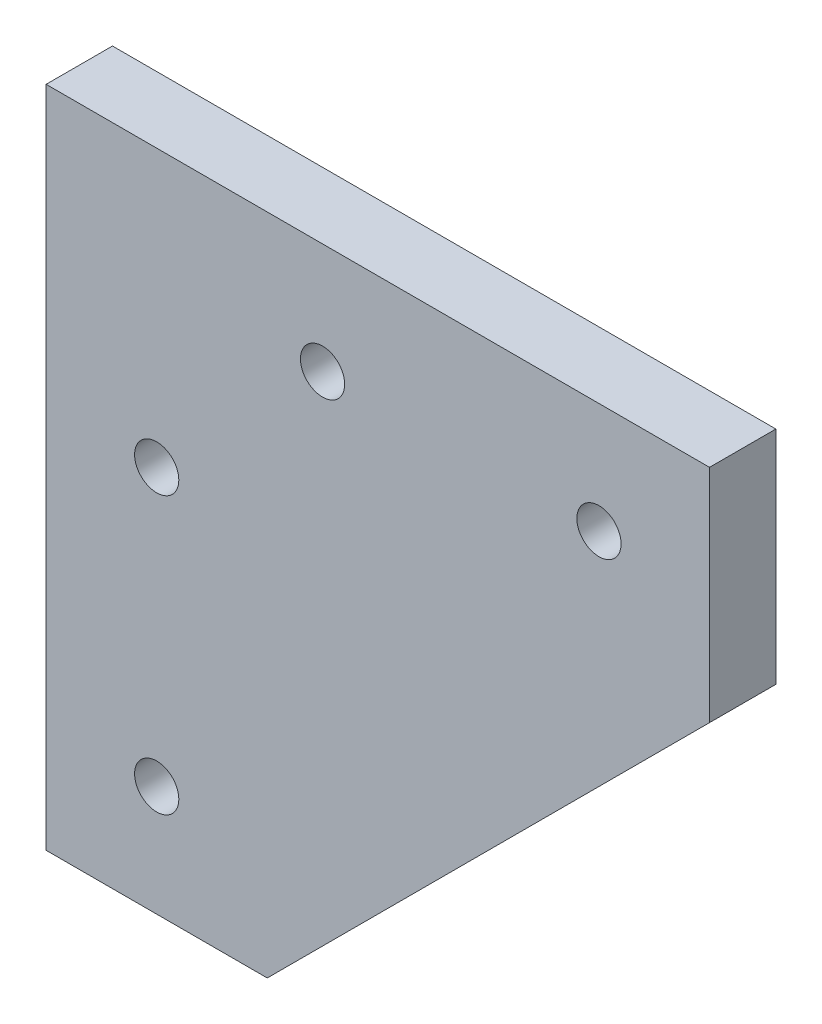
ISO-10303-21;
HEADER;
FILE_DESCRIPTION(('STEP AP214'),'2;1');
FILE_NAME('part.step','',(''),(''),'','','');
FILE_SCHEMA(('AUTOMOTIVE_DESIGN { 1 0 10303 214 1 1 1 1 }'));
ENDSEC;
DATA;
#1=APPLICATION_CONTEXT('core data for automotive mechanical design processes');
#2=APPLICATION_PROTOCOL_DEFINITION('international standard','automotive_design',2000,#1);
#3=PRODUCT_CONTEXT('',#1,'mechanical');
#4=PRODUCT('Part','Part','',(#3));
#5=PRODUCT_RELATED_PRODUCT_CATEGORY('part','',(#4));
#6=PRODUCT_DEFINITION_FORMATION('','',#4);
#7=PRODUCT_DEFINITION_CONTEXT('part definition',#1,'design');
#8=PRODUCT_DEFINITION('design','',#6,#7);
#9=PRODUCT_DEFINITION_SHAPE('','',#8);
#10=(LENGTH_UNIT() NAMED_UNIT(*) SI_UNIT(.MILLI.,.METRE.));
#11=(NAMED_UNIT(*) PLANE_ANGLE_UNIT() SI_UNIT($,.RADIAN.));
#12=(NAMED_UNIT(*) SI_UNIT($,.STERADIAN.) SOLID_ANGLE_UNIT());
#13=UNCERTAINTY_MEASURE_WITH_UNIT(LENGTH_MEASURE(1.E-05),#10,'distance_accuracy_value','');
#14=(GEOMETRIC_REPRESENTATION_CONTEXT(3) GLOBAL_UNCERTAINTY_ASSIGNED_CONTEXT((#13)) GLOBAL_UNIT_ASSIGNED_CONTEXT((#10,
#11,#12)) REPRESENTATION_CONTEXT('',''));
#15=CARTESIAN_POINT('',(0.,0.,0.));
#16=DIRECTION('',(0.,0.,1.));
#17=DIRECTION('',(1.,0.,0.));
#18=AXIS2_PLACEMENT_3D('',#15,#16,#17);
#19=CARTESIAN_POINT('',(0.,0.,6.));
#20=DIRECTION('',(0.,0.,1.));
#21=DIRECTION('',(1.,0.,0.));
#22=AXIS2_PLACEMENT_3D('',#19,#20,#21);
#23=PLANE('',#22);
#24=CARTESIAN_POINT('',(10.,-50.,6.));
#25=DIRECTION('',(0.,0.,1.));
#26=DIRECTION('',(1.,0.,0.));
#27=AXIS2_PLACEMENT_3D('',#24,#25,#26);
#28=CIRCLE('',#27,2.);
#29=CARTESIAN_POINT('',(12.,-50.,6.));
#30=VERTEX_POINT('',#29);
#31=EDGE_CURVE('E171',#30,#30,#28,.T.);
#32=ORIENTED_EDGE('',*,*,#31,.F.);
#33=EDGE_LOOP('',(#32));
#34=FACE_BOUND('',#33,.T.);
#35=CARTESIAN_POINT('',(50.,-10.,6.));
#36=DIRECTION('',(0.,0.,1.));
#37=DIRECTION('',(1.,0.,0.));
#38=AXIS2_PLACEMENT_3D('',#35,#36,#37);
#39=CIRCLE('',#38,2.);
#40=CARTESIAN_POINT('',(52.,-10.,6.));
#41=VERTEX_POINT('',#40);
#42=EDGE_CURVE('E111',#41,#41,#39,.T.);
#43=ORIENTED_EDGE('',*,*,#42,.F.);
#44=EDGE_LOOP('',(#43));
#45=FACE_BOUND('',#44,.T.);
#46=DIRECTION('',(0.,-1.,0.));
#47=VECTOR('',#46,1.);
#48=CARTESIAN_POINT('',(0.,0.,6.));
#49=LINE('',#48,#47);
#50=CARTESIAN_POINT('',(0.,0.,6.));
#51=VERTEX_POINT('',#50);
#52=CARTESIAN_POINT('',(0.,-60.,6.));
#53=VERTEX_POINT('',#52);
#54=EDGE_CURVE('E116',#51,#53,#49,.T.);
#55=ORIENTED_EDGE('',*,*,#54,.T.);
#56=DIRECTION('',(1.,0.,0.));
#57=VECTOR('',#56,1.);
#58=CARTESIAN_POINT('',(0.,-60.,6.));
#59=LINE('',#58,#57);
#60=CARTESIAN_POINT('',(20.,-60.,6.));
#61=VERTEX_POINT('',#60);
#62=EDGE_CURVE('E83',#53,#61,#59,.T.);
#63=ORIENTED_EDGE('',*,*,#62,.T.);
#64=DIRECTION('',(0.707106781186548,0.707106781186548,0.));
#65=VECTOR('',#64,1.);
#66=CARTESIAN_POINT('',(20.,-60.,6.));
#67=LINE('',#66,#65);
#68=CARTESIAN_POINT('',(60.,-20.,6.));
#69=VERTEX_POINT('',#68);
#70=EDGE_CURVE('E87',#61,#69,#67,.T.);
#71=ORIENTED_EDGE('',*,*,#70,.T.);
#72=DIRECTION('',(0.,1.,0.));
#73=VECTOR('',#72,1.);
#74=CARTESIAN_POINT('',(60.,0.,6.));
#75=LINE('',#74,#73);
#76=CARTESIAN_POINT('',(60.,0.,6.));
#77=VERTEX_POINT('',#76);
#78=EDGE_CURVE('E91',#69,#77,#75,.T.);
#79=ORIENTED_EDGE('',*,*,#78,.T.);
#80=DIRECTION('',(-1.,0.,0.));
#81=VECTOR('',#80,1.);
#82=CARTESIAN_POINT('',(0.,0.,6.));
#83=LINE('',#82,#81);
#84=EDGE_CURVE('E49',#77,#51,#83,.T.);
#85=ORIENTED_EDGE('',*,*,#84,.T.);
#86=EDGE_LOOP('',(#55,#63,#71,#79,#85));
#87=FACE_BOUND('',#86,.T.);
#88=CARTESIAN_POINT('',(25.,-10.,6.));
#89=DIRECTION('',(0.,0.,1.));
#90=DIRECTION('',(1.,0.,0.));
#91=AXIS2_PLACEMENT_3D('',#88,#89,#90);
#92=CIRCLE('',#91,2.);
#93=CARTESIAN_POINT('',(27.,-10.,6.));
#94=VERTEX_POINT('',#93);
#95=EDGE_CURVE('E177',#94,#94,#92,.T.);
#96=ORIENTED_EDGE('',*,*,#95,.F.);
#97=EDGE_LOOP('',(#96));
#98=FACE_BOUND('',#97,.T.);
#99=CARTESIAN_POINT('',(10.,-25.,6.));
#100=DIRECTION('',(0.,0.,1.));
#101=DIRECTION('',(1.,0.,0.));
#102=AXIS2_PLACEMENT_3D('',#99,#100,#101);
#103=CIRCLE('',#102,2.);
#104=CARTESIAN_POINT('',(12.,-25.,6.));
#105=VERTEX_POINT('',#104);
#106=EDGE_CURVE('E162',#105,#105,#103,.T.);
#107=ORIENTED_EDGE('',*,*,#106,.F.);
#108=EDGE_LOOP('',(#107));
#109=FACE_BOUND('',#108,.T.);
#110=ADVANCED_FACE('F32',(#34,#45,#87,#98,#109),#23,.T.);
#111=CARTESIAN_POINT('',(0.,0.,0.));
#112=DIRECTION('',(0.,0.,1.));
#113=DIRECTION('',(1.,0.,0.));
#114=AXIS2_PLACEMENT_3D('',#111,#112,#113);
#115=PLANE('',#114);
#116=DIRECTION('',(0.,-1.,0.));
#117=VECTOR('',#116,1.);
#118=CARTESIAN_POINT('',(0.,0.,0.));
#119=LINE('',#118,#117);
#120=CARTESIAN_POINT('',(0.,0.,0.));
#121=VERTEX_POINT('',#120);
#122=CARTESIAN_POINT('',(0.,-60.,0.));
#123=VERTEX_POINT('',#122);
#124=EDGE_CURVE('E107',#121,#123,#119,.T.);
#125=ORIENTED_EDGE('',*,*,#124,.F.);
#126=DIRECTION('',(-1.,0.,0.));
#127=VECTOR('',#126,1.);
#128=CARTESIAN_POINT('',(0.,0.,0.));
#129=LINE('',#128,#127);
#130=CARTESIAN_POINT('',(60.,0.,0.));
#131=VERTEX_POINT('',#130);
#132=EDGE_CURVE('E75',#131,#121,#129,.T.);
#133=ORIENTED_EDGE('',*,*,#132,.F.);
#134=DIRECTION('',(0.,1.,0.));
#135=VECTOR('',#134,1.);
#136=CARTESIAN_POINT('',(60.,0.,0.));
#137=LINE('',#136,#135);
#138=CARTESIAN_POINT('',(60.,-20.,0.));
#139=VERTEX_POINT('',#138);
#140=EDGE_CURVE('E69',#139,#131,#137,.T.);
#141=ORIENTED_EDGE('',*,*,#140,.F.);
#142=DIRECTION('',(0.707106781186548,0.707106781186548,0.));
#143=VECTOR('',#142,1.);
#144=CARTESIAN_POINT('',(20.,-60.,0.));
#145=LINE('',#144,#143);
#146=CARTESIAN_POINT('',(20.,-60.,0.));
#147=VERTEX_POINT('',#146);
#148=EDGE_CURVE('E98',#147,#139,#145,.T.);
#149=ORIENTED_EDGE('',*,*,#148,.F.);
#150=DIRECTION('',(1.,0.,0.));
#151=VECTOR('',#150,1.);
#152=CARTESIAN_POINT('',(0.,-60.,0.));
#153=LINE('',#152,#151);
#154=EDGE_CURVE('E110',#123,#147,#153,.T.);
#155=ORIENTED_EDGE('',*,*,#154,.F.);
#156=EDGE_LOOP('',(#125,#133,#141,#149,#155));
#157=FACE_BOUND('',#156,.T.);
#158=CARTESIAN_POINT('',(50.,-10.,0.));
#159=DIRECTION('',(0.,0.,1.));
#160=DIRECTION('',(1.,0.,0.));
#161=AXIS2_PLACEMENT_3D('',#158,#159,#160);
#162=CIRCLE('',#161,2.);
#163=CARTESIAN_POINT('',(52.,-10.,0.));
#164=VERTEX_POINT('',#163);
#165=EDGE_CURVE('E180',#164,#164,#162,.T.);
#166=ORIENTED_EDGE('',*,*,#165,.T.);
#167=EDGE_LOOP('',(#166));
#168=FACE_BOUND('',#167,.T.);
#169=CARTESIAN_POINT('',(25.,-10.,0.));
#170=DIRECTION('',(0.,0.,1.));
#171=DIRECTION('',(1.,0.,0.));
#172=AXIS2_PLACEMENT_3D('',#169,#170,#171);
#173=CIRCLE('',#172,2.);
#174=CARTESIAN_POINT('',(27.,-10.,0.));
#175=VERTEX_POINT('',#174);
#176=EDGE_CURVE('E174',#175,#175,#173,.T.);
#177=ORIENTED_EDGE('',*,*,#176,.T.);
#178=EDGE_LOOP('',(#177));
#179=FACE_BOUND('',#178,.T.);
#180=CARTESIAN_POINT('',(10.,-50.,0.));
#181=DIRECTION('',(0.,0.,1.));
#182=DIRECTION('',(1.,0.,0.));
#183=AXIS2_PLACEMENT_3D('',#180,#181,#182);
#184=CIRCLE('',#183,2.);
#185=CARTESIAN_POINT('',(12.,-50.,0.));
#186=VERTEX_POINT('',#185);
#187=EDGE_CURVE('E168',#186,#186,#184,.T.);
#188=ORIENTED_EDGE('',*,*,#187,.T.);
#189=EDGE_LOOP('',(#188));
#190=FACE_BOUND('',#189,.T.);
#191=CARTESIAN_POINT('',(10.,-25.,0.));
#192=DIRECTION('',(0.,0.,1.));
#193=DIRECTION('',(1.,0.,0.));
#194=AXIS2_PLACEMENT_3D('',#191,#192,#193);
#195=CIRCLE('',#194,2.);
#196=CARTESIAN_POINT('',(12.,-25.,0.));
#197=VERTEX_POINT('',#196);
#198=EDGE_CURVE('E165',#197,#197,#195,.T.);
#199=ORIENTED_EDGE('',*,*,#198,.T.);
#200=EDGE_LOOP('',(#199));
#201=FACE_BOUND('',#200,.T.);
#202=ADVANCED_FACE('F120',(#157,#168,#179,#190,#201),#115,.F.);
#203=CARTESIAN_POINT('',(0.,0.,6.));
#204=DIRECTION('',(1.,0.,0.));
#205=DIRECTION('',(0.,1.,0.));
#206=AXIS2_PLACEMENT_3D('',#203,#204,#205);
#207=PLANE('',#206);
#208=ORIENTED_EDGE('',*,*,#124,.T.);
#209=DIRECTION('',(0.,0.,-1.));
#210=VECTOR('',#209,1.);
#211=CARTESIAN_POINT('',(0.,-60.,6.));
#212=LINE('',#211,#210);
#213=EDGE_CURVE('E11',#53,#123,#212,.T.);
#214=ORIENTED_EDGE('',*,*,#213,.F.);
#215=ORIENTED_EDGE('',*,*,#54,.F.);
#216=DIRECTION('',(0.,0.,-1.));
#217=VECTOR('',#216,1.);
#218=CARTESIAN_POINT('',(0.,0.,6.));
#219=LINE('',#218,#217);
#220=EDGE_CURVE('E103',#51,#121,#219,.T.);
#221=ORIENTED_EDGE('',*,*,#220,.T.);
#222=EDGE_LOOP('',(#208,#214,#215,#221));
#223=FACE_BOUND('',#222,.T.);
#224=ADVANCED_FACE('F34',(#223),#207,.F.);
#225=CARTESIAN_POINT('',(0.,-60.,6.));
#226=DIRECTION('',(0.,1.,0.));
#227=DIRECTION('',(0.,0.,1.));
#228=AXIS2_PLACEMENT_3D('',#225,#226,#227);
#229=PLANE('',#228);
#230=ORIENTED_EDGE('',*,*,#154,.T.);
#231=DIRECTION('',(0.,0.,-1.));
#232=VECTOR('',#231,1.);
#233=CARTESIAN_POINT('',(20.,-60.,6.));
#234=LINE('',#233,#232);
#235=EDGE_CURVE('E41',#61,#147,#234,.T.);
#236=ORIENTED_EDGE('',*,*,#235,.F.);
#237=ORIENTED_EDGE('',*,*,#62,.F.);
#238=ORIENTED_EDGE('',*,*,#213,.T.);
#239=EDGE_LOOP('',(#230,#236,#237,#238));
#240=FACE_BOUND('',#239,.T.);
#241=ADVANCED_FACE('F229',(#240),#229,.F.);
#242=CARTESIAN_POINT('',(20.,-60.,6.));
#243=DIRECTION('',(-0.707106781186547,0.707106781186547,0.));
#244=DIRECTION('',(-0.707106781186548,-0.707106781186548,0.));
#245=AXIS2_PLACEMENT_3D('',#242,#243,#244);
#246=PLANE('',#245);
#247=ORIENTED_EDGE('',*,*,#148,.T.);
#248=DIRECTION('',(0.,0.,-1.));
#249=VECTOR('',#248,1.);
#250=CARTESIAN_POINT('',(60.,-20.,6.));
#251=LINE('',#250,#249);
#252=EDGE_CURVE('E95',#69,#139,#251,.T.);
#253=ORIENTED_EDGE('',*,*,#252,.F.);
#254=ORIENTED_EDGE('',*,*,#70,.F.);
#255=ORIENTED_EDGE('',*,*,#235,.T.);
#256=EDGE_LOOP('',(#247,#253,#254,#255));
#257=FACE_BOUND('',#256,.T.);
#258=ADVANCED_FACE('F96',(#257),#246,.F.);
#259=CARTESIAN_POINT('',(60.,0.,6.));
#260=DIRECTION('',(-1.,0.,0.));
#261=DIRECTION('',(0.,0.,1.));
#262=AXIS2_PLACEMENT_3D('',#259,#260,#261);
#263=PLANE('',#262);
#264=ORIENTED_EDGE('',*,*,#140,.T.);
#265=DIRECTION('',(0.,0.,-1.));
#266=VECTOR('',#265,1.);
#267=CARTESIAN_POINT('',(60.,0.,6.));
#268=LINE('',#267,#266);
#269=EDGE_CURVE('E99',#77,#131,#268,.T.);
#270=ORIENTED_EDGE('',*,*,#269,.F.);
#271=ORIENTED_EDGE('',*,*,#78,.F.);
#272=ORIENTED_EDGE('',*,*,#252,.T.);
#273=EDGE_LOOP('',(#264,#270,#271,#272));
#274=FACE_BOUND('',#273,.T.);
#275=ADVANCED_FACE('F101',(#274),#263,.F.);
#276=CARTESIAN_POINT('',(0.,0.,6.));
#277=DIRECTION('',(0.,-1.,0.));
#278=DIRECTION('',(0.,0.,-1.));
#279=AXIS2_PLACEMENT_3D('',#276,#277,#278);
#280=PLANE('',#279);
#281=ORIENTED_EDGE('',*,*,#132,.T.);
#282=ORIENTED_EDGE('',*,*,#220,.F.);
#283=ORIENTED_EDGE('',*,*,#84,.F.);
#284=ORIENTED_EDGE('',*,*,#269,.T.);
#285=EDGE_LOOP('',(#281,#282,#283,#284));
#286=FACE_BOUND('',#285,.T.);
#287=ADVANCED_FACE('F125',(#286),#280,.F.);
#288=CARTESIAN_POINT('',(50.,-10.,6.));
#289=DIRECTION('',(0.,0.,-1.));
#290=DIRECTION('',(-1.,0.,0.));
#291=AXIS2_PLACEMENT_3D('',#288,#289,#290);
#292=CYLINDRICAL_SURFACE('',#291,2.);
#293=ORIENTED_EDGE('',*,*,#42,.T.);
#294=EDGE_LOOP('',(#293));
#295=FACE_BOUND('',#294,.T.);
#296=ORIENTED_EDGE('',*,*,#165,.F.);
#297=EDGE_LOOP('',(#296));
#298=FACE_BOUND('',#297,.T.);
#299=ADVANCED_FACE('F127',(#295,#298),#292,.F.);
#300=CARTESIAN_POINT('',(25.,-10.,6.));
#301=DIRECTION('',(0.,0.,-1.));
#302=DIRECTION('',(-1.,0.,0.));
#303=AXIS2_PLACEMENT_3D('',#300,#301,#302);
#304=CYLINDRICAL_SURFACE('',#303,2.);
#305=ORIENTED_EDGE('',*,*,#95,.T.);
#306=EDGE_LOOP('',(#305));
#307=FACE_BOUND('',#306,.T.);
#308=ORIENTED_EDGE('',*,*,#176,.F.);
#309=EDGE_LOOP('',(#308));
#310=FACE_BOUND('',#309,.T.);
#311=ADVANCED_FACE('F133',(#307,#310),#304,.F.);
#312=CARTESIAN_POINT('',(10.,-50.,6.));
#313=DIRECTION('',(0.,0.,-1.));
#314=DIRECTION('',(-1.,0.,0.));
#315=AXIS2_PLACEMENT_3D('',#312,#313,#314);
#316=CYLINDRICAL_SURFACE('',#315,2.);
#317=ORIENTED_EDGE('',*,*,#31,.T.);
#318=EDGE_LOOP('',(#317));
#319=FACE_BOUND('',#318,.T.);
#320=ORIENTED_EDGE('',*,*,#187,.F.);
#321=EDGE_LOOP('',(#320));
#322=FACE_BOUND('',#321,.T.);
#323=ADVANCED_FACE('F149',(#319,#322),#316,.F.);
#324=CARTESIAN_POINT('',(10.,-25.,6.));
#325=DIRECTION('',(0.,0.,-1.));
#326=DIRECTION('',(-1.,0.,0.));
#327=AXIS2_PLACEMENT_3D('',#324,#325,#326);
#328=CYLINDRICAL_SURFACE('',#327,2.);
#329=ORIENTED_EDGE('',*,*,#106,.T.);
#330=EDGE_LOOP('',(#329));
#331=FACE_BOUND('',#330,.T.);
#332=ORIENTED_EDGE('',*,*,#198,.F.);
#333=EDGE_LOOP('',(#332));
#334=FACE_BOUND('',#333,.T.);
#335=ADVANCED_FACE('F153',(#331,#334),#328,.F.);
#336=CLOSED_SHELL('',(#110,#202,#224,#241,#258,#275,#287,#299,#311,#323,#335));
#337=MANIFOLD_SOLID_BREP('B2',#336);
#338=ADVANCED_BREP_SHAPE_REPRESENTATION('',(#18,#337),#14);
#339=SHAPE_DEFINITION_REPRESENTATION(#9,#338);
ENDSEC;
END-ISO-10303-21;
